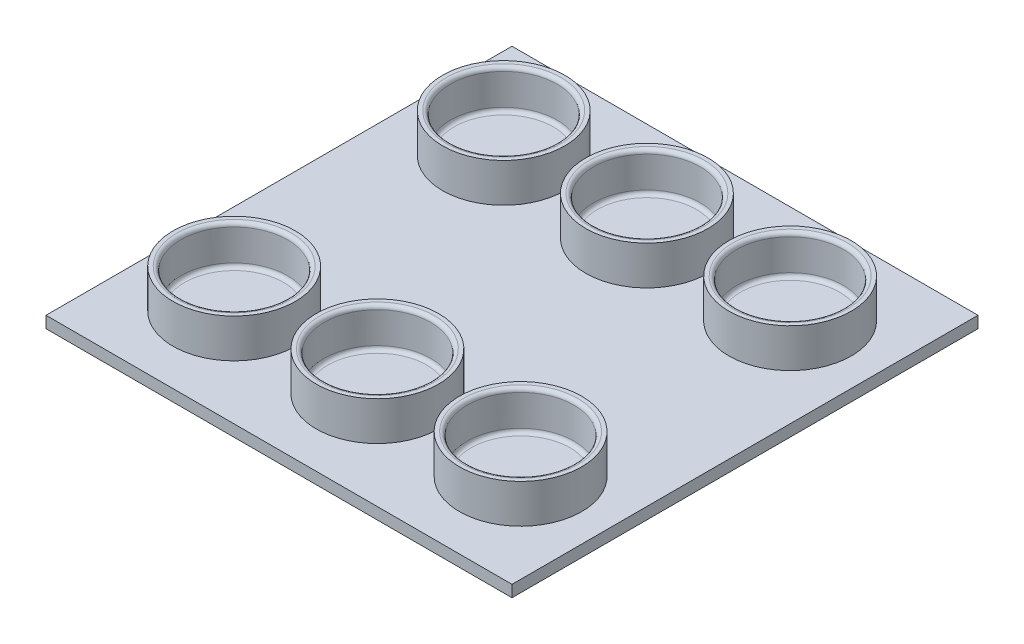
ISO-10303-21;
HEADER;
FILE_DESCRIPTION(('STEP AP214'),'2;1');
FILE_NAME('part.step','',(''),(''),'','','');
FILE_SCHEMA(('AUTOMOTIVE_DESIGN { 1 0 10303 214 1 1 1 1 }'));
ENDSEC;
DATA;
#1=APPLICATION_CONTEXT('core data for automotive mechanical design processes');
#2=APPLICATION_PROTOCOL_DEFINITION('international standard','automotive_design',2000,#1);
#3=PRODUCT_CONTEXT('',#1,'mechanical');
#4=PRODUCT('Part','Part','',(#3));
#5=PRODUCT_RELATED_PRODUCT_CATEGORY('part','',(#4));
#6=PRODUCT_DEFINITION_FORMATION('','',#4);
#7=PRODUCT_DEFINITION_CONTEXT('part definition',#1,'design');
#8=PRODUCT_DEFINITION('design','',#6,#7);
#9=PRODUCT_DEFINITION_SHAPE('','',#8);
#10=(LENGTH_UNIT() NAMED_UNIT(*) SI_UNIT(.MILLI.,.METRE.));
#11=(NAMED_UNIT(*) PLANE_ANGLE_UNIT() SI_UNIT($,.RADIAN.));
#12=(NAMED_UNIT(*) SI_UNIT($,.STERADIAN.) SOLID_ANGLE_UNIT());
#13=UNCERTAINTY_MEASURE_WITH_UNIT(LENGTH_MEASURE(1.E-05),#10,'distance_accuracy_value','');
#14=(GEOMETRIC_REPRESENTATION_CONTEXT(3) GLOBAL_UNCERTAINTY_ASSIGNED_CONTEXT((#13)) GLOBAL_UNIT_ASSIGNED_CONTEXT((#10,
#11,#12)) REPRESENTATION_CONTEXT('',''));
#15=CARTESIAN_POINT('',(0.,0.,0.));
#16=DIRECTION('',(0.,0.,1.));
#17=DIRECTION('',(1.,0.,0.));
#18=AXIS2_PLACEMENT_3D('',#15,#16,#17);
#19=CARTESIAN_POINT('',(60.,3.,-60.));
#20=DIRECTION('',(-1.,0.,0.));
#21=DIRECTION('',(0.,0.,1.));
#22=AXIS2_PLACEMENT_3D('',#19,#20,#21);
#23=PLANE('',#22);
#24=DIRECTION('',(0.,0.,-1.));
#25=VECTOR('',#24,1.);
#26=CARTESIAN_POINT('',(60.,0.,-60.));
#27=LINE('',#26,#25);
#28=CARTESIAN_POINT('',(60.,0.,60.));
#29=VERTEX_POINT('',#28);
#30=CARTESIAN_POINT('',(60.,0.,-60.));
#31=VERTEX_POINT('',#30);
#32=EDGE_CURVE('E112',#29,#31,#27,.T.);
#33=ORIENTED_EDGE('',*,*,#32,.T.);
#34=DIRECTION('',(0.,-1.,0.));
#35=VECTOR('',#34,1.);
#36=CARTESIAN_POINT('',(60.,3.,-60.));
#37=LINE('',#36,#35);
#38=CARTESIAN_POINT('',(60.,3.,-60.));
#39=VERTEX_POINT('',#38);
#40=EDGE_CURVE('E101',#39,#31,#37,.T.);
#41=ORIENTED_EDGE('',*,*,#40,.F.);
#42=DIRECTION('',(0.,0.,-1.));
#43=VECTOR('',#42,1.);
#44=CARTESIAN_POINT('',(60.,3.,-60.));
#45=LINE('',#44,#43);
#46=CARTESIAN_POINT('',(60.,3.,60.));
#47=VERTEX_POINT('',#46);
#48=EDGE_CURVE('E93',#47,#39,#45,.T.);
#49=ORIENTED_EDGE('',*,*,#48,.F.);
#50=DIRECTION('',(0.,-1.,0.));
#51=VECTOR('',#50,1.);
#52=CARTESIAN_POINT('',(60.,3.,60.));
#53=LINE('',#52,#51);
#54=EDGE_CURVE('E108',#47,#29,#53,.T.);
#55=ORIENTED_EDGE('',*,*,#54,.T.);
#56=EDGE_LOOP('',(#33,#41,#49,#55));
#57=FACE_BOUND('',#56,.T.);
#58=ADVANCED_FACE('F39',(#57),#23,.F.);
#59=CARTESIAN_POINT('',(-60.,3.,-60.));
#60=DIRECTION('',(0.,0.,1.));
#61=DIRECTION('',(1.,0.,0.));
#62=AXIS2_PLACEMENT_3D('',#59,#60,#61);
#63=PLANE('',#62);
#64=DIRECTION('',(-1.,0.,0.));
#65=VECTOR('',#64,1.);
#66=CARTESIAN_POINT('',(-60.,0.,-60.));
#67=LINE('',#66,#65);
#68=CARTESIAN_POINT('',(-60.,0.,-60.));
#69=VERTEX_POINT('',#68);
#70=EDGE_CURVE('E99',#31,#69,#67,.T.);
#71=ORIENTED_EDGE('',*,*,#70,.T.);
#72=DIRECTION('',(0.,-1.,0.));
#73=VECTOR('',#72,1.);
#74=CARTESIAN_POINT('',(-60.,3.,-60.));
#75=LINE('',#74,#73);
#76=CARTESIAN_POINT('',(-60.,3.,-60.));
#77=VERTEX_POINT('',#76);
#78=EDGE_CURVE('E97',#77,#69,#75,.T.);
#79=ORIENTED_EDGE('',*,*,#78,.F.);
#80=DIRECTION('',(-1.,0.,0.));
#81=VECTOR('',#80,1.);
#82=CARTESIAN_POINT('',(-60.,3.,-60.));
#83=LINE('',#82,#81);
#84=EDGE_CURVE('E88',#39,#77,#83,.T.);
#85=ORIENTED_EDGE('',*,*,#84,.F.);
#86=ORIENTED_EDGE('',*,*,#40,.T.);
#87=EDGE_LOOP('',(#71,#79,#85,#86));
#88=FACE_BOUND('',#87,.T.);
#89=ADVANCED_FACE('F98',(#88),#63,.F.);
#90=CARTESIAN_POINT('',(-60.,3.,-60.));
#91=DIRECTION('',(1.,0.,0.));
#92=DIRECTION('',(0.,0.,-1.));
#93=AXIS2_PLACEMENT_3D('',#90,#91,#92);
#94=PLANE('',#93);
#95=DIRECTION('',(0.,0.,1.));
#96=VECTOR('',#95,1.);
#97=CARTESIAN_POINT('',(-60.,0.,-60.));
#98=LINE('',#97,#96);
#99=CARTESIAN_POINT('',(-60.,0.,60.));
#100=VERTEX_POINT('',#99);
#101=EDGE_CURVE('E74',#69,#100,#98,.T.);
#102=ORIENTED_EDGE('',*,*,#101,.T.);
#103=DIRECTION('',(0.,-1.,0.));
#104=VECTOR('',#103,1.);
#105=CARTESIAN_POINT('',(-60.,3.,60.));
#106=LINE('',#105,#104);
#107=CARTESIAN_POINT('',(-60.,3.,60.));
#108=VERTEX_POINT('',#107);
#109=EDGE_CURVE('E102',#108,#100,#106,.T.);
#110=ORIENTED_EDGE('',*,*,#109,.F.);
#111=DIRECTION('',(0.,0.,1.));
#112=VECTOR('',#111,1.);
#113=CARTESIAN_POINT('',(-60.,3.,-60.));
#114=LINE('',#113,#112);
#115=EDGE_CURVE('E91',#77,#108,#114,.T.);
#116=ORIENTED_EDGE('',*,*,#115,.F.);
#117=ORIENTED_EDGE('',*,*,#78,.T.);
#118=EDGE_LOOP('',(#102,#110,#116,#117));
#119=FACE_BOUND('',#118,.T.);
#120=ADVANCED_FACE('F104',(#119),#94,.F.);
#121=CARTESIAN_POINT('',(-60.,3.,60.));
#122=DIRECTION('',(0.,0.,-1.));
#123=DIRECTION('',(-1.,0.,0.));
#124=AXIS2_PLACEMENT_3D('',#121,#122,#123);
#125=PLANE('',#124);
#126=DIRECTION('',(1.,0.,0.));
#127=VECTOR('',#126,1.);
#128=CARTESIAN_POINT('',(-60.,0.,60.));
#129=LINE('',#128,#127);
#130=EDGE_CURVE('E80',#100,#29,#129,.T.);
#131=ORIENTED_EDGE('',*,*,#130,.T.);
#132=ORIENTED_EDGE('',*,*,#54,.F.);
#133=DIRECTION('',(1.,0.,0.));
#134=VECTOR('',#133,1.);
#135=CARTESIAN_POINT('',(-60.,3.,60.));
#136=LINE('',#135,#134);
#137=EDGE_CURVE('E57',#108,#47,#136,.T.);
#138=ORIENTED_EDGE('',*,*,#137,.F.);
#139=ORIENTED_EDGE('',*,*,#109,.T.);
#140=EDGE_LOOP('',(#131,#132,#138,#139));
#141=FACE_BOUND('',#140,.T.);
#142=ADVANCED_FACE('F353',(#141),#125,.F.);
#143=CARTESIAN_POINT('',(0.,3.,0.));
#144=DIRECTION('',(0.,1.,0.));
#145=DIRECTION('',(0.,0.,1.));
#146=AXIS2_PLACEMENT_3D('',#143,#144,#145);
#147=PLANE('',#146);
#148=CARTESIAN_POINT('',(-36.7302923875263,3.,-34.5937889313101));
#149=DIRECTION('',(0.,1.,0.));
#150=DIRECTION('',(0.,0.,1.));
#151=AXIS2_PLACEMENT_3D('',#148,#149,#150);
#152=CIRCLE('',#151,15.75);
#153=CARTESIAN_POINT('',(-36.7302923875263,3.,-18.8437889313101));
#154=VERTEX_POINT('',#153);
#155=EDGE_CURVE('E611',#154,#154,#152,.T.);
#156=ORIENTED_EDGE('',*,*,#155,.F.);
#157=EDGE_LOOP('',(#156));
#158=FACE_BOUND('',#157,.T.);
#159=CARTESIAN_POINT('',(-36.7302923875263,3.,34.8146003500208));
#160=DIRECTION('',(0.,1.,0.));
#161=DIRECTION('',(0.,0.,-1.));
#162=AXIS2_PLACEMENT_3D('',#159,#160,#161);
#163=CIRCLE('',#162,15.75);
#164=CARTESIAN_POINT('',(-36.7302923875263,3.,19.0646003500208));
#165=VERTEX_POINT('',#164);
#166=EDGE_CURVE('E600',#165,#165,#163,.T.);
#167=ORIENTED_EDGE('',*,*,#166,.F.);
#168=EDGE_LOOP('',(#167));
#169=FACE_BOUND('',#168,.T.);
#170=CARTESIAN_POINT('',(37.0247076124737,3.,-34.5937889313103));
#171=DIRECTION('',(0.,1.,0.));
#172=DIRECTION('',(0.,0.,1.));
#173=AXIS2_PLACEMENT_3D('',#170,#171,#172);
#174=CIRCLE('',#173,15.75);
#175=CARTESIAN_POINT('',(37.0247076124737,3.,-18.8437889313103));
#176=VERTEX_POINT('',#175);
#177=EDGE_CURVE('E599',#176,#176,#174,.T.);
#178=ORIENTED_EDGE('',*,*,#177,.F.);
#179=EDGE_LOOP('',(#178));
#180=FACE_BOUND('',#179,.T.);
#181=CARTESIAN_POINT('',(37.0247076124737,3.,34.8146003500206));
#182=DIRECTION('',(0.,1.,0.));
#183=DIRECTION('',(0.,0.,-1.));
#184=AXIS2_PLACEMENT_3D('',#181,#182,#183);
#185=CIRCLE('',#184,15.75);
#186=CARTESIAN_POINT('',(37.0247076124737,3.,19.0646003500206));
#187=VERTEX_POINT('',#186);
#188=EDGE_CURVE('E616',#187,#187,#185,.T.);
#189=ORIENTED_EDGE('',*,*,#188,.F.);
#190=EDGE_LOOP('',(#189));
#191=FACE_BOUND('',#190,.T.);
#192=CARTESIAN_POINT('',(0.149707612473668,3.,34.8146003500206));
#193=DIRECTION('',(0.,1.,0.));
#194=DIRECTION('',(0.,0.,-1.));
#195=AXIS2_PLACEMENT_3D('',#192,#193,#194);
#196=CIRCLE('',#195,15.75);
#197=CARTESIAN_POINT('',(0.149707612473668,3.,19.0646003500206));
#198=VERTEX_POINT('',#197);
#199=EDGE_CURVE('E622',#198,#198,#196,.T.);
#200=ORIENTED_EDGE('',*,*,#199,.F.);
#201=EDGE_LOOP('',(#200));
#202=FACE_BOUND('',#201,.T.);
#203=CARTESIAN_POINT('',(0.149707612473668,3.,-34.5937889313103));
#204=DIRECTION('',(0.,1.,0.));
#205=DIRECTION('',(0.,0.,1.));
#206=AXIS2_PLACEMENT_3D('',#203,#204,#205);
#207=CIRCLE('',#206,15.75);
#208=CARTESIAN_POINT('',(0.149707612473668,3.,-18.8437889313103));
#209=VERTEX_POINT('',#208);
#210=EDGE_CURVE('E630',#209,#209,#207,.T.);
#211=ORIENTED_EDGE('',*,*,#210,.F.);
#212=EDGE_LOOP('',(#211));
#213=FACE_BOUND('',#212,.T.);
#214=ORIENTED_EDGE('',*,*,#48,.T.);
#215=ORIENTED_EDGE('',*,*,#84,.T.);
#216=ORIENTED_EDGE('',*,*,#115,.T.);
#217=ORIENTED_EDGE('',*,*,#137,.T.);
#218=EDGE_LOOP('',(#214,#215,#216,#217));
#219=FACE_BOUND('',#218,.T.);
#220=ADVANCED_FACE('F89',(#158,#169,#180,#191,#202,#213,#219),#147,.T.);
#221=CARTESIAN_POINT('',(0.,0.,0.));
#222=DIRECTION('',(0.,1.,0.));
#223=DIRECTION('',(0.,0.,1.));
#224=AXIS2_PLACEMENT_3D('',#221,#222,#223);
#225=PLANE('',#224);
#226=ORIENTED_EDGE('',*,*,#32,.F.);
#227=ORIENTED_EDGE('',*,*,#130,.F.);
#228=ORIENTED_EDGE('',*,*,#101,.F.);
#229=ORIENTED_EDGE('',*,*,#70,.F.);
#230=EDGE_LOOP('',(#226,#227,#228,#229));
#231=FACE_BOUND('',#230,.T.);
#232=ADVANCED_FACE('F347',(#231),#225,.F.);
#233=CARTESIAN_POINT('',(0.149707612473668,13.,-34.5937889313103));
#234=DIRECTION('',(0.,1.,0.));
#235=DIRECTION('',(0.,0.,1.));
#236=AXIS2_PLACEMENT_3D('',#233,#234,#235);
#237=PLANE('',#236);
#238=CARTESIAN_POINT('',(0.149707612473668,13.,-34.5937889313103));
#239=DIRECTION('',(0.,1.,0.));
#240=DIRECTION('',(0.,0.,1.));
#241=AXIS2_PLACEMENT_3D('',#238,#239,#240);
#242=CIRCLE('',#241,14.75);
#243=CARTESIAN_POINT('',(0.149707612473668,13.,-19.8437889313103));
#244=VERTEX_POINT('',#243);
#245=EDGE_CURVE('E149',#244,#244,#242,.F.);
#246=ORIENTED_EDGE('',*,*,#245,.T.);
#247=EDGE_LOOP('',(#246));
#248=FACE_BOUND('',#247,.T.);
#249=CARTESIAN_POINT('',(0.149707612473668,13.,-34.5937889313103));
#250=DIRECTION('',(0.,1.,0.));
#251=DIRECTION('',(0.,0.,1.));
#252=AXIS2_PLACEMENT_3D('',#249,#250,#251);
#253=CIRCLE('',#252,15.75);
#254=CARTESIAN_POINT('',(0.149707612473668,13.,-18.8437889313103));
#255=VERTEX_POINT('',#254);
#256=EDGE_CURVE('E116',#255,#255,#253,.T.);
#257=ORIENTED_EDGE('',*,*,#256,.T.);
#258=EDGE_LOOP('',(#257));
#259=FACE_BOUND('',#258,.T.);
#260=ADVANCED_FACE('F344',(#248,#259),#237,.T.);
#261=CARTESIAN_POINT('',(0.149707612473668,13.,-34.5937889313103));
#262=DIRECTION('',(0.,-1.,0.));
#263=DIRECTION('',(0.,0.,-1.));
#264=AXIS2_PLACEMENT_3D('',#261,#262,#263);
#265=CYLINDRICAL_SURFACE('',#264,15.75);
#266=ORIENTED_EDGE('',*,*,#256,.F.);
#267=EDGE_LOOP('',(#266));
#268=FACE_BOUND('',#267,.T.);
#269=ORIENTED_EDGE('',*,*,#210,.T.);
#270=EDGE_LOOP('',(#269));
#271=FACE_BOUND('',#270,.T.);
#272=ADVANCED_FACE('F342',(#268,#271),#265,.T.);
#273=CARTESIAN_POINT('',(0.149707612473668,13.,-34.5937889313103));
#274=DIRECTION('',(0.,-1.,0.));
#275=DIRECTION('',(0.,0.,-1.));
#276=AXIS2_PLACEMENT_3D('',#273,#274,#275);
#277=CYLINDRICAL_SURFACE('',#276,13.75);
#278=CARTESIAN_POINT('',(0.149707612473668,4.,-34.5937889313103));
#279=DIRECTION('',(0.,1.,0.));
#280=DIRECTION('',(0.,0.,1.));
#281=AXIS2_PLACEMENT_3D('',#278,#279,#280);
#282=CIRCLE('',#281,13.75);
#283=CARTESIAN_POINT('',(0.149707612473668,4.,-20.8437889313103));
#284=VERTEX_POINT('',#283);
#285=EDGE_CURVE('E209',#284,#284,#282,.F.);
#286=ORIENTED_EDGE('',*,*,#285,.T.);
#287=EDGE_LOOP('',(#286));
#288=FACE_BOUND('',#287,.T.);
#289=CARTESIAN_POINT('',(0.149707612473668,12.,-34.5937889313103));
#290=DIRECTION('',(0.,1.,0.));
#291=DIRECTION('',(0.,0.,1.));
#292=AXIS2_PLACEMENT_3D('',#289,#290,#291);
#293=CIRCLE('',#292,13.75);
#294=CARTESIAN_POINT('',(0.149707612473668,12.,-20.8437889313103));
#295=VERTEX_POINT('',#294);
#296=EDGE_CURVE('E145',#295,#295,#293,.T.);
#297=ORIENTED_EDGE('',*,*,#296,.T.);
#298=EDGE_LOOP('',(#297));
#299=FACE_BOUND('',#298,.T.);
#300=ADVANCED_FACE('F339',(#288,#299),#277,.F.);
#301=CARTESIAN_POINT('',(0.149707612473668,3.,-34.5937889313103));
#302=DIRECTION('',(0.,1.,0.));
#303=DIRECTION('',(0.,0.,1.));
#304=AXIS2_PLACEMENT_3D('',#301,#302,#303);
#305=CIRCLE('',#304,12.75);
#306=CARTESIAN_POINT('',(0.149707612473668,3.,-21.8437889313103));
#307=VERTEX_POINT('',#306);
#308=EDGE_CURVE('E213',#307,#307,#305,.T.);
#309=ORIENTED_EDGE('',*,*,#308,.T.);
#310=EDGE_LOOP('',(#309));
#311=FACE_BOUND('',#310,.T.);
#312=ADVANCED_FACE('F334',(#311),#147,.T.);
#313=CARTESIAN_POINT('',(0.149707612473668,13.,34.8146003500206));
#314=DIRECTION('',(0.,-1.,0.));
#315=DIRECTION('',(0.,0.,-1.));
#316=AXIS2_PLACEMENT_3D('',#313,#314,#315);
#317=PLANE('',#316);
#318=CARTESIAN_POINT('',(0.149707612473668,13.,34.8146003500206));
#319=DIRECTION('',(0.,-1.,0.));
#320=DIRECTION('',(0.,0.,-1.));
#321=AXIS2_PLACEMENT_3D('',#318,#319,#320);
#322=CIRCLE('',#321,14.75);
#323=CARTESIAN_POINT('',(0.149707612473668,13.,20.0646003500206));
#324=VERTEX_POINT('',#323);
#325=EDGE_CURVE('E189',#324,#324,#322,.T.);
#326=ORIENTED_EDGE('',*,*,#325,.T.);
#327=EDGE_LOOP('',(#326));
#328=FACE_BOUND('',#327,.T.);
#329=CARTESIAN_POINT('',(0.149707612473668,13.,34.8146003500206));
#330=DIRECTION('',(0.,1.,0.));
#331=DIRECTION('',(0.,0.,-1.));
#332=AXIS2_PLACEMENT_3D('',#329,#330,#331);
#333=CIRCLE('',#332,15.75);
#334=CARTESIAN_POINT('',(0.149707612473668,13.,19.0646003500206));
#335=VERTEX_POINT('',#334);
#336=EDGE_CURVE('E626',#335,#335,#333,.T.);
#337=ORIENTED_EDGE('',*,*,#336,.T.);
#338=EDGE_LOOP('',(#337));
#339=FACE_BOUND('',#338,.T.);
#340=ADVANCED_FACE('F331',(#328,#339),#317,.F.);
#341=CARTESIAN_POINT('',(0.149707612473668,13.,34.8146003500206));
#342=DIRECTION('',(0.,-1.,0.));
#343=DIRECTION('',(0.,0.,-1.));
#344=AXIS2_PLACEMENT_3D('',#341,#342,#343);
#345=CYLINDRICAL_SURFACE('',#344,15.75);
#346=ORIENTED_EDGE('',*,*,#336,.F.);
#347=EDGE_LOOP('',(#346));
#348=FACE_BOUND('',#347,.T.);
#349=ORIENTED_EDGE('',*,*,#199,.T.);
#350=EDGE_LOOP('',(#349));
#351=FACE_BOUND('',#350,.T.);
#352=ADVANCED_FACE('F329',(#348,#351),#345,.T.);
#353=CARTESIAN_POINT('',(0.149707612473668,13.,34.8146003500206));
#354=DIRECTION('',(0.,-1.,0.));
#355=DIRECTION('',(0.,0.,-1.));
#356=AXIS2_PLACEMENT_3D('',#353,#354,#355);
#357=CYLINDRICAL_SURFACE('',#356,13.75);
#358=CARTESIAN_POINT('',(0.149707612473668,12.,34.8146003500206));
#359=DIRECTION('',(0.,-1.,0.));
#360=DIRECTION('',(0.,0.,-1.));
#361=AXIS2_PLACEMENT_3D('',#358,#359,#360);
#362=CIRCLE('',#361,13.75);
#363=CARTESIAN_POINT('',(0.149707612473668,12.,21.0646003500206));
#364=VERTEX_POINT('',#363);
#365=EDGE_CURVE('E185',#364,#364,#362,.F.);
#366=ORIENTED_EDGE('',*,*,#365,.T.);
#367=EDGE_LOOP('',(#366));
#368=FACE_BOUND('',#367,.T.);
#369=CARTESIAN_POINT('',(0.149707612473668,4.,34.8146003500206));
#370=DIRECTION('',(0.,1.,0.));
#371=DIRECTION('',(0.,0.,1.));
#372=AXIS2_PLACEMENT_3D('',#369,#370,#371);
#373=CIRCLE('',#372,13.75);
#374=CARTESIAN_POINT('',(0.149707612473668,4.,48.5646003500206));
#375=VERTEX_POINT('',#374);
#376=EDGE_CURVE('E153',#375,#375,#373,.F.);
#377=ORIENTED_EDGE('',*,*,#376,.T.);
#378=EDGE_LOOP('',(#377));
#379=FACE_BOUND('',#378,.T.);
#380=ADVANCED_FACE('F326',(#368,#379),#357,.F.);
#381=CARTESIAN_POINT('',(0.149707612473668,3.,34.8146003500206));
#382=DIRECTION('',(0.,1.,0.));
#383=DIRECTION('',(0.,0.,1.));
#384=AXIS2_PLACEMENT_3D('',#381,#382,#383);
#385=CIRCLE('',#384,12.75);
#386=CARTESIAN_POINT('',(0.149707612473668,3.,47.5646003500206));
#387=VERTEX_POINT('',#386);
#388=EDGE_CURVE('E157',#387,#387,#385,.T.);
#389=ORIENTED_EDGE('',*,*,#388,.T.);
#390=EDGE_LOOP('',(#389));
#391=FACE_BOUND('',#390,.T.);
#392=ADVANCED_FACE('F321',(#391),#147,.T.);
#393=CARTESIAN_POINT('',(37.0247076124737,13.,34.8146003500206));
#394=DIRECTION('',(0.,-1.,0.));
#395=DIRECTION('',(0.,0.,-1.));
#396=AXIS2_PLACEMENT_3D('',#393,#394,#395);
#397=PLANE('',#396);
#398=CARTESIAN_POINT('',(37.0247076124737,13.,34.8146003500206));
#399=DIRECTION('',(0.,-1.,0.));
#400=DIRECTION('',(0.,0.,-1.));
#401=AXIS2_PLACEMENT_3D('',#398,#399,#400);
#402=CIRCLE('',#401,14.75);
#403=CARTESIAN_POINT('',(37.0247076124737,13.,20.0646003500206));
#404=VERTEX_POINT('',#403);
#405=EDGE_CURVE('E133',#404,#404,#402,.T.);
#406=ORIENTED_EDGE('',*,*,#405,.T.);
#407=EDGE_LOOP('',(#406));
#408=FACE_BOUND('',#407,.T.);
#409=CARTESIAN_POINT('',(37.0247076124737,13.,34.8146003500206));
#410=DIRECTION('',(0.,1.,0.));
#411=DIRECTION('',(0.,0.,-1.));
#412=AXIS2_PLACEMENT_3D('',#409,#410,#411);
#413=CIRCLE('',#412,15.75);
#414=CARTESIAN_POINT('',(37.0247076124737,13.,19.0646003500206));
#415=VERTEX_POINT('',#414);
#416=EDGE_CURVE('E618',#415,#415,#413,.T.);
#417=ORIENTED_EDGE('',*,*,#416,.T.);
#418=EDGE_LOOP('',(#417));
#419=FACE_BOUND('',#418,.T.);
#420=ADVANCED_FACE('F318',(#408,#419),#397,.F.);
#421=CARTESIAN_POINT('',(37.0247076124737,13.,34.8146003500206));
#422=DIRECTION('',(0.,-1.,0.));
#423=DIRECTION('',(0.,0.,-1.));
#424=AXIS2_PLACEMENT_3D('',#421,#422,#423);
#425=CYLINDRICAL_SURFACE('',#424,15.75);
#426=ORIENTED_EDGE('',*,*,#416,.F.);
#427=EDGE_LOOP('',(#426));
#428=FACE_BOUND('',#427,.T.);
#429=ORIENTED_EDGE('',*,*,#188,.T.);
#430=EDGE_LOOP('',(#429));
#431=FACE_BOUND('',#430,.T.);
#432=ADVANCED_FACE('F316',(#428,#431),#425,.T.);
#433=CARTESIAN_POINT('',(37.0247076124737,13.,34.8146003500206));
#434=DIRECTION('',(0.,-1.,0.));
#435=DIRECTION('',(0.,0.,-1.));
#436=AXIS2_PLACEMENT_3D('',#433,#434,#435);
#437=CYLINDRICAL_SURFACE('',#436,13.75);
#438=CARTESIAN_POINT('',(37.0247076124737,4.,34.8146003500206));
#439=DIRECTION('',(0.,1.,0.));
#440=DIRECTION('',(0.,0.,1.));
#441=AXIS2_PLACEMENT_3D('',#438,#439,#440);
#442=CIRCLE('',#441,13.75);
#443=CARTESIAN_POINT('',(37.0247076124737,4.,48.5646003500206));
#444=VERTEX_POINT('',#443);
#445=EDGE_CURVE('E193',#444,#444,#442,.F.);
#446=ORIENTED_EDGE('',*,*,#445,.T.);
#447=EDGE_LOOP('',(#446));
#448=FACE_BOUND('',#447,.T.);
#449=CARTESIAN_POINT('',(37.0247076124737,12.,34.8146003500206));
#450=DIRECTION('',(0.,-1.,0.));
#451=DIRECTION('',(0.,0.,-1.));
#452=AXIS2_PLACEMENT_3D('',#449,#450,#451);
#453=CIRCLE('',#452,13.75);
#454=CARTESIAN_POINT('',(37.0247076124737,12.,21.0646003500206));
#455=VERTEX_POINT('',#454);
#456=EDGE_CURVE('E129',#455,#455,#453,.F.);
#457=ORIENTED_EDGE('',*,*,#456,.T.);
#458=EDGE_LOOP('',(#457));
#459=FACE_BOUND('',#458,.T.);
#460=ADVANCED_FACE('F313',(#448,#459),#437,.F.);
#461=CARTESIAN_POINT('',(37.0247076124737,3.,34.8146003500206));
#462=DIRECTION('',(0.,1.,0.));
#463=DIRECTION('',(0.,0.,1.));
#464=AXIS2_PLACEMENT_3D('',#461,#462,#463);
#465=CIRCLE('',#464,12.75);
#466=CARTESIAN_POINT('',(37.0247076124737,3.,47.5646003500206));
#467=VERTEX_POINT('',#466);
#468=EDGE_CURVE('E197',#467,#467,#465,.T.);
#469=ORIENTED_EDGE('',*,*,#468,.T.);
#470=EDGE_LOOP('',(#469));
#471=FACE_BOUND('',#470,.T.);
#472=ADVANCED_FACE('F301',(#471),#147,.T.);
#473=CARTESIAN_POINT('',(37.0247076124737,13.,-34.5937889313103));
#474=DIRECTION('',(0.,1.,0.));
#475=DIRECTION('',(0.,0.,1.));
#476=AXIS2_PLACEMENT_3D('',#473,#474,#475);
#477=PLANE('',#476);
#478=CARTESIAN_POINT('',(37.0247076124737,13.,-34.5937889313103));
#479=DIRECTION('',(0.,1.,0.));
#480=DIRECTION('',(0.,0.,1.));
#481=AXIS2_PLACEMENT_3D('',#478,#479,#480);
#482=CIRCLE('',#481,14.75);
#483=CARTESIAN_POINT('',(37.0247076124737,13.,-19.8437889313103));
#484=VERTEX_POINT('',#483);
#485=EDGE_CURVE('E205',#484,#484,#482,.F.);
#486=ORIENTED_EDGE('',*,*,#485,.T.);
#487=EDGE_LOOP('',(#486));
#488=FACE_BOUND('',#487,.T.);
#489=CARTESIAN_POINT('',(37.0247076124737,13.,-34.5937889313103));
#490=DIRECTION('',(0.,1.,0.));
#491=DIRECTION('',(0.,0.,1.));
#492=AXIS2_PLACEMENT_3D('',#489,#490,#491);
#493=CIRCLE('',#492,15.75);
#494=CARTESIAN_POINT('',(37.0247076124737,13.,-18.8437889313103));
#495=VERTEX_POINT('',#494);
#496=EDGE_CURVE('E605',#495,#495,#493,.T.);
#497=ORIENTED_EDGE('',*,*,#496,.T.);
#498=EDGE_LOOP('',(#497));
#499=FACE_BOUND('',#498,.T.);
#500=ADVANCED_FACE('F303',(#488,#499),#477,.T.);
#501=CARTESIAN_POINT('',(37.0247076124737,13.,-34.5937889313103));
#502=DIRECTION('',(0.,-1.,0.));
#503=DIRECTION('',(0.,0.,-1.));
#504=AXIS2_PLACEMENT_3D('',#501,#502,#503);
#505=CYLINDRICAL_SURFACE('',#504,15.75);
#506=ORIENTED_EDGE('',*,*,#496,.F.);
#507=EDGE_LOOP('',(#506));
#508=FACE_BOUND('',#507,.T.);
#509=ORIENTED_EDGE('',*,*,#177,.T.);
#510=EDGE_LOOP('',(#509));
#511=FACE_BOUND('',#510,.T.);
#512=ADVANCED_FACE('F290',(#508,#511),#505,.T.);
#513=CARTESIAN_POINT('',(37.0247076124737,13.,-34.5937889313103));
#514=DIRECTION('',(0.,-1.,0.));
#515=DIRECTION('',(0.,0.,-1.));
#516=AXIS2_PLACEMENT_3D('',#513,#514,#515);
#517=CYLINDRICAL_SURFACE('',#516,13.75);
#518=CARTESIAN_POINT('',(37.0247076124737,12.,-34.5937889313103));
#519=DIRECTION('',(0.,1.,0.));
#520=DIRECTION('',(0.,0.,1.));
#521=AXIS2_PLACEMENT_3D('',#518,#519,#520);
#522=CIRCLE('',#521,13.75);
#523=CARTESIAN_POINT('',(37.0247076124737,12.,-20.8437889313103));
#524=VERTEX_POINT('',#523);
#525=EDGE_CURVE('E201',#524,#524,#522,.T.);
#526=ORIENTED_EDGE('',*,*,#525,.T.);
#527=EDGE_LOOP('',(#526));
#528=FACE_BOUND('',#527,.T.);
#529=CARTESIAN_POINT('',(37.0247076124737,4.,-34.5937889313103));
#530=DIRECTION('',(0.,1.,0.));
#531=DIRECTION('',(0.,0.,1.));
#532=AXIS2_PLACEMENT_3D('',#529,#530,#531);
#533=CIRCLE('',#532,13.75);
#534=CARTESIAN_POINT('',(37.0247076124737,4.,-20.8437889313103));
#535=VERTEX_POINT('',#534);
#536=EDGE_CURVE('E137',#535,#535,#533,.F.);
#537=ORIENTED_EDGE('',*,*,#536,.T.);
#538=EDGE_LOOP('',(#537));
#539=FACE_BOUND('',#538,.T.);
#540=ADVANCED_FACE('F286',(#528,#539),#517,.F.);
#541=CARTESIAN_POINT('',(37.0247076124737,3.,-34.5937889313103));
#542=DIRECTION('',(0.,1.,0.));
#543=DIRECTION('',(0.,0.,1.));
#544=AXIS2_PLACEMENT_3D('',#541,#542,#543);
#545=CIRCLE('',#544,12.75);
#546=CARTESIAN_POINT('',(37.0247076124737,3.,-21.8437889313103));
#547=VERTEX_POINT('',#546);
#548=EDGE_CURVE('E141',#547,#547,#545,.T.);
#549=ORIENTED_EDGE('',*,*,#548,.T.);
#550=EDGE_LOOP('',(#549));
#551=FACE_BOUND('',#550,.T.);
#552=ADVANCED_FACE('F289',(#551),#147,.T.);
#553=CARTESIAN_POINT('',(-36.7302923875263,13.,34.8146003500208));
#554=DIRECTION('',(0.,-1.,0.));
#555=DIRECTION('',(0.,0.,-1.));
#556=AXIS2_PLACEMENT_3D('',#553,#554,#555);
#557=PLANE('',#556);
#558=CARTESIAN_POINT('',(-36.7302923875263,13.,34.8146003500208));
#559=DIRECTION('',(0.,-1.,0.));
#560=DIRECTION('',(0.,0.,-1.));
#561=AXIS2_PLACEMENT_3D('',#558,#559,#560);
#562=CIRCLE('',#561,14.75);
#563=CARTESIAN_POINT('',(-36.7302923875263,13.,20.0646003500208));
#564=VERTEX_POINT('',#563);
#565=EDGE_CURVE('E181',#564,#564,#562,.T.);
#566=ORIENTED_EDGE('',*,*,#565,.T.);
#567=EDGE_LOOP('',(#566));
#568=FACE_BOUND('',#567,.T.);
#569=CARTESIAN_POINT('',(-36.7302923875263,13.,34.8146003500208));
#570=DIRECTION('',(0.,1.,0.));
#571=DIRECTION('',(0.,0.,-1.));
#572=AXIS2_PLACEMENT_3D('',#569,#570,#571);
#573=CIRCLE('',#572,15.75);
#574=CARTESIAN_POINT('',(-36.7302923875263,13.,19.0646003500208));
#575=VERTEX_POINT('',#574);
#576=EDGE_CURVE('E597',#575,#575,#573,.T.);
#577=ORIENTED_EDGE('',*,*,#576,.T.);
#578=EDGE_LOOP('',(#577));
#579=FACE_BOUND('',#578,.T.);
#580=ADVANCED_FACE('F298',(#568,#579),#557,.F.);
#581=CARTESIAN_POINT('',(-36.7302923875263,13.,34.8146003500208));
#582=DIRECTION('',(0.,-1.,0.));
#583=DIRECTION('',(0.,0.,-1.));
#584=AXIS2_PLACEMENT_3D('',#581,#582,#583);
#585=CYLINDRICAL_SURFACE('',#584,15.75);
#586=ORIENTED_EDGE('',*,*,#576,.F.);
#587=EDGE_LOOP('',(#586));
#588=FACE_BOUND('',#587,.T.);
#589=ORIENTED_EDGE('',*,*,#166,.T.);
#590=EDGE_LOOP('',(#589));
#591=FACE_BOUND('',#590,.T.);
#592=ADVANCED_FACE('F308',(#588,#591),#585,.T.);
#593=CARTESIAN_POINT('',(-36.7302923875263,13.,34.8146003500208));
#594=DIRECTION('',(0.,-1.,0.));
#595=DIRECTION('',(0.,0.,-1.));
#596=AXIS2_PLACEMENT_3D('',#593,#594,#595);
#597=CYLINDRICAL_SURFACE('',#596,13.75);
#598=CARTESIAN_POINT('',(-36.7302923875263,12.,34.8146003500208));
#599=DIRECTION('',(0.,-1.,0.));
#600=DIRECTION('',(0.,0.,-1.));
#601=AXIS2_PLACEMENT_3D('',#598,#599,#600);
#602=CIRCLE('',#601,13.75);
#603=CARTESIAN_POINT('',(-36.7302923875263,12.,21.0646003500208));
#604=VERTEX_POINT('',#603);
#605=EDGE_CURVE('E177',#604,#604,#602,.F.);
#606=ORIENTED_EDGE('',*,*,#605,.T.);
#607=EDGE_LOOP('',(#606));
#608=FACE_BOUND('',#607,.T.);
#609=CARTESIAN_POINT('',(-36.7302923875263,4.,34.8146003500208));
#610=DIRECTION('',(0.,1.,0.));
#611=DIRECTION('',(0.,0.,1.));
#612=AXIS2_PLACEMENT_3D('',#609,#610,#611);
#613=CIRCLE('',#612,13.75);
#614=CARTESIAN_POINT('',(-36.7302923875263,4.,48.5646003500208));
#615=VERTEX_POINT('',#614);
#616=EDGE_CURVE('E161',#615,#615,#613,.F.);
#617=ORIENTED_EDGE('',*,*,#616,.T.);
#618=EDGE_LOOP('',(#617));
#619=FACE_BOUND('',#618,.T.);
#620=ADVANCED_FACE('F450',(#608,#619),#597,.F.);
#621=CARTESIAN_POINT('',(-36.7302923875263,3.,34.8146003500208));
#622=DIRECTION('',(0.,1.,0.));
#623=DIRECTION('',(0.,0.,1.));
#624=AXIS2_PLACEMENT_3D('',#621,#622,#623);
#625=CIRCLE('',#624,12.75);
#626=CARTESIAN_POINT('',(-36.7302923875263,3.,47.5646003500208));
#627=VERTEX_POINT('',#626);
#628=EDGE_CURVE('E165',#627,#627,#625,.T.);
#629=ORIENTED_EDGE('',*,*,#628,.T.);
#630=EDGE_LOOP('',(#629));
#631=FACE_BOUND('',#630,.T.);
#632=ADVANCED_FACE('F302',(#631),#147,.T.);
#633=CARTESIAN_POINT('',(-36.7302923875263,13.,-34.5937889313101));
#634=DIRECTION('',(0.,1.,0.));
#635=DIRECTION('',(0.,0.,1.));
#636=AXIS2_PLACEMENT_3D('',#633,#634,#635);
#637=PLANE('',#636);
#638=CARTESIAN_POINT('',(-36.7302923875263,13.,-34.5937889313101));
#639=DIRECTION('',(0.,1.,0.));
#640=DIRECTION('',(0.,0.,1.));
#641=AXIS2_PLACEMENT_3D('',#638,#639,#640);
#642=CIRCLE('',#641,14.75);
#643=CARTESIAN_POINT('',(-36.7302923875263,13.,-19.8437889313101));
#644=VERTEX_POINT('',#643);
#645=EDGE_CURVE('E173',#644,#644,#642,.F.);
#646=ORIENTED_EDGE('',*,*,#645,.T.);
#647=EDGE_LOOP('',(#646));
#648=FACE_BOUND('',#647,.T.);
#649=CARTESIAN_POINT('',(-36.7302923875263,13.,-34.5937889313101));
#650=DIRECTION('',(0.,1.,0.));
#651=DIRECTION('',(0.,0.,1.));
#652=AXIS2_PLACEMENT_3D('',#649,#650,#651);
#653=CIRCLE('',#652,15.75);
#654=CARTESIAN_POINT('',(-36.7302923875263,13.,-18.8437889313101));
#655=VERTEX_POINT('',#654);
#656=EDGE_CURVE('E608',#655,#655,#653,.T.);
#657=ORIENTED_EDGE('',*,*,#656,.T.);
#658=EDGE_LOOP('',(#657));
#659=FACE_BOUND('',#658,.T.);
#660=ADVANCED_FACE('F463',(#648,#659),#637,.T.);
#661=CARTESIAN_POINT('',(-36.7302923875263,13.,-34.5937889313101));
#662=DIRECTION('',(0.,-1.,0.));
#663=DIRECTION('',(0.,0.,-1.));
#664=AXIS2_PLACEMENT_3D('',#661,#662,#663);
#665=CYLINDRICAL_SURFACE('',#664,15.75);
#666=ORIENTED_EDGE('',*,*,#656,.F.);
#667=EDGE_LOOP('',(#666));
#668=FACE_BOUND('',#667,.T.);
#669=ORIENTED_EDGE('',*,*,#155,.T.);
#670=EDGE_LOOP('',(#669));
#671=FACE_BOUND('',#670,.T.);
#672=ADVANCED_FACE('F459',(#668,#671),#665,.T.);
#673=CARTESIAN_POINT('',(-36.7302923875263,13.,-34.5937889313101));
#674=DIRECTION('',(0.,-1.,0.));
#675=DIRECTION('',(0.,0.,-1.));
#676=AXIS2_PLACEMENT_3D('',#673,#674,#675);
#677=CYLINDRICAL_SURFACE('',#676,13.75);
#678=CARTESIAN_POINT('',(-36.7302923875263,4.,-34.5937889313101));
#679=DIRECTION('',(0.,1.,0.));
#680=DIRECTION('',(0.,0.,1.));
#681=AXIS2_PLACEMENT_3D('',#678,#679,#680);
#682=CIRCLE('',#681,13.75);
#683=CARTESIAN_POINT('',(-36.7302923875263,4.,-20.8437889313101));
#684=VERTEX_POINT('',#683);
#685=EDGE_CURVE('E49',#684,#684,#682,.F.);
#686=ORIENTED_EDGE('',*,*,#685,.T.);
#687=EDGE_LOOP('',(#686));
#688=FACE_BOUND('',#687,.T.);
#689=CARTESIAN_POINT('',(-36.7302923875263,12.,-34.5937889313101));
#690=DIRECTION('',(0.,1.,0.));
#691=DIRECTION('',(0.,0.,1.));
#692=AXIS2_PLACEMENT_3D('',#689,#690,#691);
#693=CIRCLE('',#692,13.75);
#694=CARTESIAN_POINT('',(-36.7302923875263,12.,-20.8437889313101));
#695=VERTEX_POINT('',#694);
#696=EDGE_CURVE('E169',#695,#695,#693,.T.);
#697=ORIENTED_EDGE('',*,*,#696,.T.);
#698=EDGE_LOOP('',(#697));
#699=FACE_BOUND('',#698,.T.);
#700=ADVANCED_FACE('F220',(#688,#699),#677,.F.);
#701=CARTESIAN_POINT('',(-36.7302923875263,3.,-34.5937889313101));
#702=DIRECTION('',(0.,1.,0.));
#703=DIRECTION('',(0.,0.,1.));
#704=AXIS2_PLACEMENT_3D('',#701,#702,#703);
#705=CIRCLE('',#704,12.75);
#706=CARTESIAN_POINT('',(-36.7302923875263,3.,-21.8437889313101));
#707=VERTEX_POINT('',#706);
#708=EDGE_CURVE('E11',#707,#707,#705,.T.);
#709=ORIENTED_EDGE('',*,*,#708,.T.);
#710=EDGE_LOOP('',(#709));
#711=FACE_BOUND('',#710,.T.);
#712=ADVANCED_FACE('F245',(#711),#147,.T.);
#713=CARTESIAN_POINT('',(37.0247076124737,12.,34.8146003500206));
#714=DIRECTION('',(0.,-1.,0.));
#715=DIRECTION('',(0.,0.,-1.));
#716=AXIS2_PLACEMENT_3D('',#713,#714,#715);
#717=TOROIDAL_SURFACE('',#716,14.75,1.);
#718=ORIENTED_EDGE('',*,*,#405,.F.);
#719=EDGE_LOOP('',(#718));
#720=FACE_BOUND('',#719,.T.);
#721=ORIENTED_EDGE('',*,*,#456,.F.);
#722=EDGE_LOOP('',(#721));
#723=FACE_BOUND('',#722,.T.);
#724=ADVANCED_FACE('F241',(#720,#723),#717,.T.);
#725=CARTESIAN_POINT('',(37.0247076124737,4.,-34.5937889313103));
#726=DIRECTION('',(0.,1.,0.));
#727=DIRECTION('',(0.,0.,1.));
#728=AXIS2_PLACEMENT_3D('',#725,#726,#727);
#729=TOROIDAL_SURFACE('',#728,12.75,1.);
#730=ORIENTED_EDGE('',*,*,#548,.F.);
#731=EDGE_LOOP('',(#730));
#732=FACE_BOUND('',#731,.T.);
#733=ORIENTED_EDGE('',*,*,#536,.F.);
#734=EDGE_LOOP('',(#733));
#735=FACE_BOUND('',#734,.T.);
#736=ADVANCED_FACE('F244',(#732,#735),#729,.F.);
#737=CARTESIAN_POINT('',(0.149707612473668,12.,-34.5937889313103));
#738=DIRECTION('',(0.,1.,0.));
#739=DIRECTION('',(0.,0.,1.));
#740=AXIS2_PLACEMENT_3D('',#737,#738,#739);
#741=TOROIDAL_SURFACE('',#740,14.75,1.);
#742=ORIENTED_EDGE('',*,*,#245,.F.);
#743=EDGE_LOOP('',(#742));
#744=FACE_BOUND('',#743,.T.);
#745=ORIENTED_EDGE('',*,*,#296,.F.);
#746=EDGE_LOOP('',(#745));
#747=FACE_BOUND('',#746,.T.);
#748=ADVANCED_FACE('F249',(#744,#747),#741,.T.);
#749=CARTESIAN_POINT('',(0.149707612473668,4.,34.8146003500206));
#750=DIRECTION('',(0.,1.,0.));
#751=DIRECTION('',(0.,0.,1.));
#752=AXIS2_PLACEMENT_3D('',#749,#750,#751);
#753=TOROIDAL_SURFACE('',#752,12.75,1.);
#754=ORIENTED_EDGE('',*,*,#388,.F.);
#755=EDGE_LOOP('',(#754));
#756=FACE_BOUND('',#755,.T.);
#757=ORIENTED_EDGE('',*,*,#376,.F.);
#758=EDGE_LOOP('',(#757));
#759=FACE_BOUND('',#758,.T.);
#760=ADVANCED_FACE('F253',(#756,#759),#753,.F.);
#761=CARTESIAN_POINT('',(-36.7302923875263,4.,34.8146003500208));
#762=DIRECTION('',(0.,1.,0.));
#763=DIRECTION('',(0.,0.,1.));
#764=AXIS2_PLACEMENT_3D('',#761,#762,#763);
#765=TOROIDAL_SURFACE('',#764,12.75,1.);
#766=ORIENTED_EDGE('',*,*,#628,.F.);
#767=EDGE_LOOP('',(#766));
#768=FACE_BOUND('',#767,.T.);
#769=ORIENTED_EDGE('',*,*,#616,.F.);
#770=EDGE_LOOP('',(#769));
#771=FACE_BOUND('',#770,.T.);
#772=ADVANCED_FACE('F257',(#768,#771),#765,.F.);
#773=CARTESIAN_POINT('',(-36.7302923875263,12.,-34.5937889313101));
#774=DIRECTION('',(0.,1.,0.));
#775=DIRECTION('',(0.,0.,1.));
#776=AXIS2_PLACEMENT_3D('',#773,#774,#775);
#777=TOROIDAL_SURFACE('',#776,14.75,1.);
#778=ORIENTED_EDGE('',*,*,#645,.F.);
#779=EDGE_LOOP('',(#778));
#780=FACE_BOUND('',#779,.T.);
#781=ORIENTED_EDGE('',*,*,#696,.F.);
#782=EDGE_LOOP('',(#781));
#783=FACE_BOUND('',#782,.T.);
#784=ADVANCED_FACE('F261',(#780,#783),#777,.T.);
#785=CARTESIAN_POINT('',(-36.7302923875263,12.,34.8146003500208));
#786=DIRECTION('',(0.,-1.,0.));
#787=DIRECTION('',(0.,0.,-1.));
#788=AXIS2_PLACEMENT_3D('',#785,#786,#787);
#789=TOROIDAL_SURFACE('',#788,14.75,1.);
#790=ORIENTED_EDGE('',*,*,#565,.F.);
#791=EDGE_LOOP('',(#790));
#792=FACE_BOUND('',#791,.T.);
#793=ORIENTED_EDGE('',*,*,#605,.F.);
#794=EDGE_LOOP('',(#793));
#795=FACE_BOUND('',#794,.T.);
#796=ADVANCED_FACE('F265',(#792,#795),#789,.T.);
#797=CARTESIAN_POINT('',(0.149707612473668,12.,34.8146003500206));
#798=DIRECTION('',(0.,-1.,0.));
#799=DIRECTION('',(0.,0.,-1.));
#800=AXIS2_PLACEMENT_3D('',#797,#798,#799);
#801=TOROIDAL_SURFACE('',#800,14.75,1.);
#802=ORIENTED_EDGE('',*,*,#325,.F.);
#803=EDGE_LOOP('',(#802));
#804=FACE_BOUND('',#803,.T.);
#805=ORIENTED_EDGE('',*,*,#365,.F.);
#806=EDGE_LOOP('',(#805));
#807=FACE_BOUND('',#806,.T.);
#808=ADVANCED_FACE('F269',(#804,#807),#801,.T.);
#809=CARTESIAN_POINT('',(37.0247076124737,4.,34.8146003500206));
#810=DIRECTION('',(0.,1.,0.));
#811=DIRECTION('',(0.,0.,1.));
#812=AXIS2_PLACEMENT_3D('',#809,#810,#811);
#813=TOROIDAL_SURFACE('',#812,12.75,1.);
#814=ORIENTED_EDGE('',*,*,#468,.F.);
#815=EDGE_LOOP('',(#814));
#816=FACE_BOUND('',#815,.T.);
#817=ORIENTED_EDGE('',*,*,#445,.F.);
#818=EDGE_LOOP('',(#817));
#819=FACE_BOUND('',#818,.T.);
#820=ADVANCED_FACE('F273',(#816,#819),#813,.F.);
#821=CARTESIAN_POINT('',(37.0247076124737,12.,-34.5937889313103));
#822=DIRECTION('',(0.,1.,0.));
#823=DIRECTION('',(0.,0.,1.));
#824=AXIS2_PLACEMENT_3D('',#821,#822,#823);
#825=TOROIDAL_SURFACE('',#824,14.75,1.);
#826=ORIENTED_EDGE('',*,*,#485,.F.);
#827=EDGE_LOOP('',(#826));
#828=FACE_BOUND('',#827,.T.);
#829=ORIENTED_EDGE('',*,*,#525,.F.);
#830=EDGE_LOOP('',(#829));
#831=FACE_BOUND('',#830,.T.);
#832=ADVANCED_FACE('F229',(#828,#831),#825,.T.);
#833=CARTESIAN_POINT('',(0.149707612473668,4.,-34.5937889313103));
#834=DIRECTION('',(0.,1.,0.));
#835=DIRECTION('',(0.,0.,1.));
#836=AXIS2_PLACEMENT_3D('',#833,#834,#835);
#837=TOROIDAL_SURFACE('',#836,12.75,1.);
#838=ORIENTED_EDGE('',*,*,#308,.F.);
#839=EDGE_LOOP('',(#838));
#840=FACE_BOUND('',#839,.T.);
#841=ORIENTED_EDGE('',*,*,#285,.F.);
#842=EDGE_LOOP('',(#841));
#843=FACE_BOUND('',#842,.T.);
#844=ADVANCED_FACE('F224',(#840,#843),#837,.F.);
#845=CARTESIAN_POINT('',(-36.7302923875263,4.,-34.5937889313101));
#846=DIRECTION('',(0.,1.,0.));
#847=DIRECTION('',(0.,0.,1.));
#848=AXIS2_PLACEMENT_3D('',#845,#846,#847);
#849=TOROIDAL_SURFACE('',#848,12.75,1.);
#850=ORIENTED_EDGE('',*,*,#708,.F.);
#851=EDGE_LOOP('',(#850));
#852=FACE_BOUND('',#851,.T.);
#853=ORIENTED_EDGE('',*,*,#685,.F.);
#854=EDGE_LOOP('',(#853));
#855=FACE_BOUND('',#854,.T.);
#856=ADVANCED_FACE('F41',(#852,#855),#849,.F.);
#857=CLOSED_SHELL('',(#58,#89,#120,#142,#220,#232,#260,#272,#300,#312,#340,#352,#380,#392,#420,
#432,#460,#472,#500,#512,#540,#552,#580,#592,#620,#632,#660,#672,#700,#712,#724,#736,#748,#760,
#772,#784,#796,#808,#820,#832,#844,#856));
#858=MANIFOLD_SOLID_BREP('B2',#857);
#859=ADVANCED_BREP_SHAPE_REPRESENTATION('',(#18,#858),#14);
#860=SHAPE_DEFINITION_REPRESENTATION(#9,#859);
ENDSEC;
END-ISO-10303-21;
